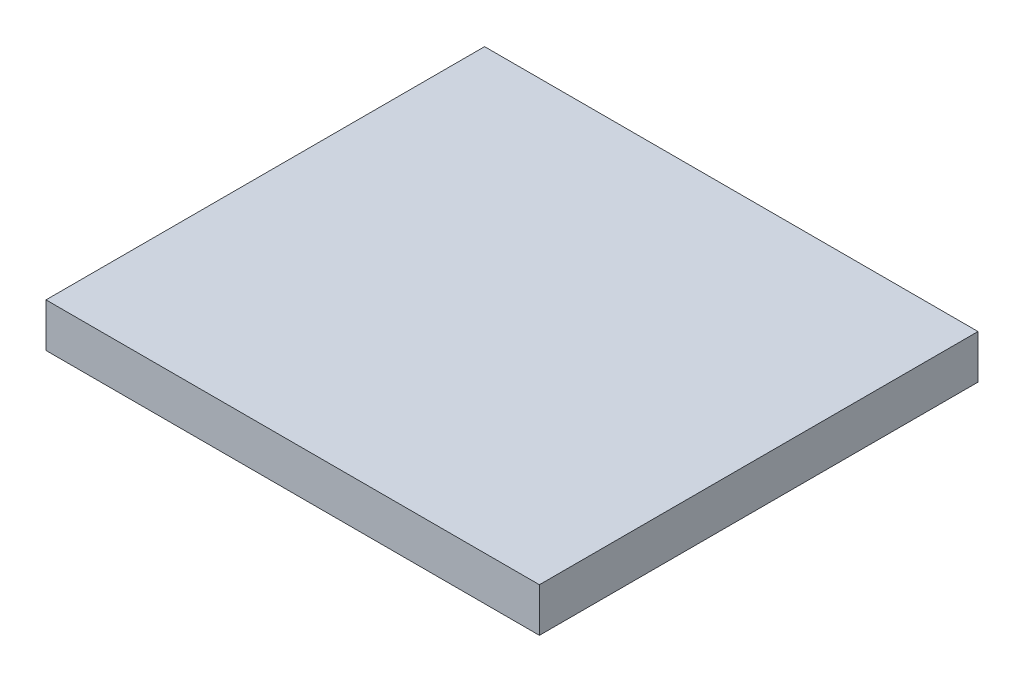
ISO-10303-21;
HEADER;
FILE_DESCRIPTION(('STEP AP214'),'2;1');
FILE_NAME('part.step','',(''),(''),'','','');
FILE_SCHEMA(('AUTOMOTIVE_DESIGN { 1 0 10303 214 1 1 1 1 }'));
ENDSEC;
DATA;
#1=APPLICATION_CONTEXT('core data for automotive mechanical design processes');
#2=APPLICATION_PROTOCOL_DEFINITION('international standard','automotive_design',2000,#1);
#3=PRODUCT_CONTEXT('',#1,'mechanical');
#4=PRODUCT('Part','Part','',(#3));
#5=PRODUCT_RELATED_PRODUCT_CATEGORY('part','',(#4));
#6=PRODUCT_DEFINITION_FORMATION('','',#4);
#7=PRODUCT_DEFINITION_CONTEXT('part definition',#1,'design');
#8=PRODUCT_DEFINITION('design','',#6,#7);
#9=PRODUCT_DEFINITION_SHAPE('','',#8);
#10=(LENGTH_UNIT() NAMED_UNIT(*) SI_UNIT(.MILLI.,.METRE.));
#11=(NAMED_UNIT(*) PLANE_ANGLE_UNIT() SI_UNIT($,.RADIAN.));
#12=(NAMED_UNIT(*) SI_UNIT($,.STERADIAN.) SOLID_ANGLE_UNIT());
#13=UNCERTAINTY_MEASURE_WITH_UNIT(LENGTH_MEASURE(1.E-05),#10,'distance_accuracy_value','');
#14=(GEOMETRIC_REPRESENTATION_CONTEXT(3) GLOBAL_UNCERTAINTY_ASSIGNED_CONTEXT((#13)) GLOBAL_UNIT_ASSIGNED_CONTEXT((#10,
#11,#12)) REPRESENTATION_CONTEXT('',''));
#15=CARTESIAN_POINT('',(0.,0.,0.));
#16=DIRECTION('',(0.,0.,1.));
#17=DIRECTION('',(1.,0.,0.));
#18=AXIS2_PLACEMENT_3D('',#15,#16,#17);
#19=CARTESIAN_POINT('',(9.,1.6,8.));
#20=DIRECTION('',(-1.,0.,0.));
#21=DIRECTION('',(0.,0.,1.));
#22=AXIS2_PLACEMENT_3D('',#19,#20,#21);
#23=PLANE('',#22);
#24=DIRECTION('',(0.,0.,-1.));
#25=VECTOR('',#24,1.);
#26=CARTESIAN_POINT('',(9.,0.,8.));
#27=LINE('',#26,#25);
#28=CARTESIAN_POINT('',(9.,0.,8.));
#29=VERTEX_POINT('',#28);
#30=CARTESIAN_POINT('',(9.,0.,-8.));
#31=VERTEX_POINT('',#30);
#32=EDGE_CURVE('E99',#29,#31,#27,.T.);
#33=ORIENTED_EDGE('',*,*,#32,.T.);
#34=DIRECTION('',(0.,-1.,0.));
#35=VECTOR('',#34,1.);
#36=CARTESIAN_POINT('',(9.,1.6,-8.));
#37=LINE('',#36,#35);
#38=CARTESIAN_POINT('',(9.,1.6,-8.));
#39=VERTEX_POINT('',#38);
#40=EDGE_CURVE('E11',#39,#31,#37,.T.);
#41=ORIENTED_EDGE('',*,*,#40,.F.);
#42=DIRECTION('',(0.,0.,-1.));
#43=VECTOR('',#42,1.);
#44=CARTESIAN_POINT('',(9.,1.6,8.));
#45=LINE('',#44,#43);
#46=CARTESIAN_POINT('',(9.,1.6,8.));
#47=VERTEX_POINT('',#46);
#48=EDGE_CURVE('E87',#47,#39,#45,.T.);
#49=ORIENTED_EDGE('',*,*,#48,.F.);
#50=DIRECTION('',(0.,-1.,0.));
#51=VECTOR('',#50,1.);
#52=CARTESIAN_POINT('',(9.,1.6,8.));
#53=LINE('',#52,#51);
#54=EDGE_CURVE('E95',#47,#29,#53,.T.);
#55=ORIENTED_EDGE('',*,*,#54,.T.);
#56=EDGE_LOOP('',(#33,#41,#49,#55));
#57=FACE_BOUND('',#56,.T.);
#58=ADVANCED_FACE('F36',(#57),#23,.F.);
#59=CARTESIAN_POINT('',(-9.,1.6,-8.));
#60=DIRECTION('',(0.,0.,1.));
#61=DIRECTION('',(1.,0.,0.));
#62=AXIS2_PLACEMENT_3D('',#59,#60,#61);
#63=PLANE('',#62);
#64=DIRECTION('',(-1.,0.,0.));
#65=VECTOR('',#64,1.);
#66=CARTESIAN_POINT('',(-9.,0.,-8.));
#67=LINE('',#66,#65);
#68=CARTESIAN_POINT('',(-9.,0.,-8.));
#69=VERTEX_POINT('',#68);
#70=EDGE_CURVE('E91',#31,#69,#67,.T.);
#71=ORIENTED_EDGE('',*,*,#70,.T.);
#72=DIRECTION('',(0.,-1.,0.));
#73=VECTOR('',#72,1.);
#74=CARTESIAN_POINT('',(-9.,1.6,-8.));
#75=LINE('',#74,#73);
#76=CARTESIAN_POINT('',(-9.,1.6,-8.));
#77=VERTEX_POINT('',#76);
#78=EDGE_CURVE('E44',#77,#69,#75,.T.);
#79=ORIENTED_EDGE('',*,*,#78,.F.);
#80=DIRECTION('',(-1.,0.,0.));
#81=VECTOR('',#80,1.);
#82=CARTESIAN_POINT('',(-9.,1.6,-8.));
#83=LINE('',#82,#81);
#84=EDGE_CURVE('E82',#39,#77,#83,.T.);
#85=ORIENTED_EDGE('',*,*,#84,.F.);
#86=ORIENTED_EDGE('',*,*,#40,.T.);
#87=EDGE_LOOP('',(#71,#79,#85,#86));
#88=FACE_BOUND('',#87,.T.);
#89=ADVANCED_FACE('F90',(#88),#63,.F.);
#90=CARTESIAN_POINT('',(-9.,1.6,8.));
#91=DIRECTION('',(1.,0.,0.));
#92=DIRECTION('',(0.,0.,-1.));
#93=AXIS2_PLACEMENT_3D('',#90,#91,#92);
#94=PLANE('',#93);
#95=DIRECTION('',(0.,0.,1.));
#96=VECTOR('',#95,1.);
#97=CARTESIAN_POINT('',(-9.,0.,8.));
#98=LINE('',#97,#96);
#99=CARTESIAN_POINT('',(-9.,0.,8.));
#100=VERTEX_POINT('',#99);
#101=EDGE_CURVE('E69',#69,#100,#98,.T.);
#102=ORIENTED_EDGE('',*,*,#101,.T.);
#103=DIRECTION('',(0.,-1.,0.));
#104=VECTOR('',#103,1.);
#105=CARTESIAN_POINT('',(-9.,1.6,8.));
#106=LINE('',#105,#104);
#107=CARTESIAN_POINT('',(-9.,1.6,8.));
#108=VERTEX_POINT('',#107);
#109=EDGE_CURVE('E92',#108,#100,#106,.T.);
#110=ORIENTED_EDGE('',*,*,#109,.F.);
#111=DIRECTION('',(0.,0.,1.));
#112=VECTOR('',#111,1.);
#113=CARTESIAN_POINT('',(-9.,1.6,8.));
#114=LINE('',#113,#112);
#115=EDGE_CURVE('E85',#77,#108,#114,.T.);
#116=ORIENTED_EDGE('',*,*,#115,.F.);
#117=ORIENTED_EDGE('',*,*,#78,.T.);
#118=EDGE_LOOP('',(#102,#110,#116,#117));
#119=FACE_BOUND('',#118,.T.);
#120=ADVANCED_FACE('F93',(#119),#94,.F.);
#121=CARTESIAN_POINT('',(-9.,1.6,8.));
#122=DIRECTION('',(0.,0.,-1.));
#123=DIRECTION('',(-1.,0.,0.));
#124=AXIS2_PLACEMENT_3D('',#121,#122,#123);
#125=PLANE('',#124);
#126=DIRECTION('',(1.,0.,0.));
#127=VECTOR('',#126,1.);
#128=CARTESIAN_POINT('',(-9.,0.,8.));
#129=LINE('',#128,#127);
#130=EDGE_CURVE('E75',#100,#29,#129,.T.);
#131=ORIENTED_EDGE('',*,*,#130,.T.);
#132=ORIENTED_EDGE('',*,*,#54,.F.);
#133=DIRECTION('',(1.,0.,0.));
#134=VECTOR('',#133,1.);
#135=CARTESIAN_POINT('',(-9.,1.6,8.));
#136=LINE('',#135,#134);
#137=EDGE_CURVE('E52',#108,#47,#136,.T.);
#138=ORIENTED_EDGE('',*,*,#137,.F.);
#139=ORIENTED_EDGE('',*,*,#109,.T.);
#140=EDGE_LOOP('',(#131,#132,#138,#139));
#141=FACE_BOUND('',#140,.T.);
#142=ADVANCED_FACE('F106',(#141),#125,.F.);
#143=CARTESIAN_POINT('',(0.,1.6,0.));
#144=DIRECTION('',(0.,-1.,0.));
#145=DIRECTION('',(0.,0.,-1.));
#146=AXIS2_PLACEMENT_3D('',#143,#144,#145);
#147=PLANE('',#146);
#148=ORIENTED_EDGE('',*,*,#48,.T.);
#149=ORIENTED_EDGE('',*,*,#84,.T.);
#150=ORIENTED_EDGE('',*,*,#115,.T.);
#151=ORIENTED_EDGE('',*,*,#137,.T.);
#152=EDGE_LOOP('',(#148,#149,#150,#151));
#153=FACE_BOUND('',#152,.T.);
#154=ADVANCED_FACE('F83',(#153),#147,.F.);
#155=CARTESIAN_POINT('',(0.,0.,0.));
#156=DIRECTION('',(0.,-1.,0.));
#157=DIRECTION('',(0.,0.,-1.));
#158=AXIS2_PLACEMENT_3D('',#155,#156,#157);
#159=PLANE('',#158);
#160=ORIENTED_EDGE('',*,*,#32,.F.);
#161=ORIENTED_EDGE('',*,*,#130,.F.);
#162=ORIENTED_EDGE('',*,*,#101,.F.);
#163=ORIENTED_EDGE('',*,*,#70,.F.);
#164=EDGE_LOOP('',(#160,#161,#162,#163));
#165=FACE_BOUND('',#164,.T.);
#166=ADVANCED_FACE('F109',(#165),#159,.T.);
#167=CLOSED_SHELL('',(#58,#89,#120,#142,#154,#166));
#168=MANIFOLD_SOLID_BREP('B2',#167);
#169=ADVANCED_BREP_SHAPE_REPRESENTATION('',(#18,#168),#14);
#170=SHAPE_DEFINITION_REPRESENTATION(#9,#169);
ENDSEC;
END-ISO-10303-21;
